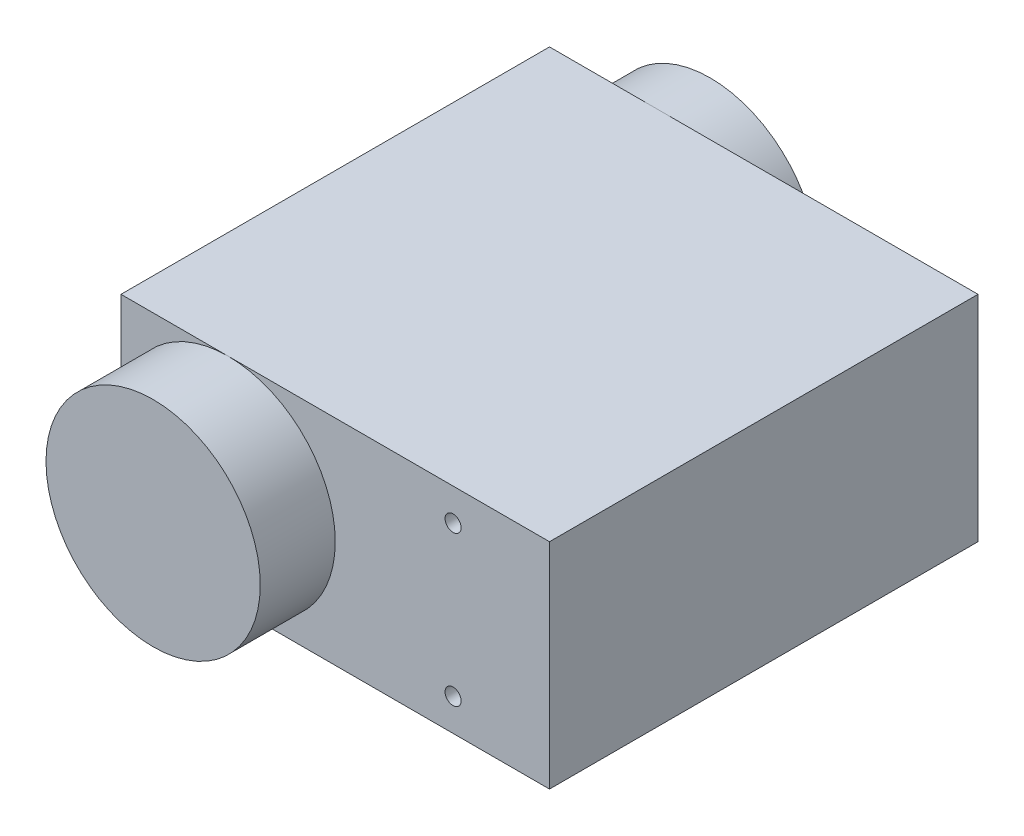
ISO-10303-21;
HEADER;
FILE_DESCRIPTION(('STEP AP214'),'2;1');
FILE_NAME('part.step','',(''),(''),'','','');
FILE_SCHEMA(('AUTOMOTIVE_DESIGN { 1 0 10303 214 1 1 1 1 }'));
ENDSEC;
DATA;
#1=APPLICATION_CONTEXT('core data for automotive mechanical design processes');
#2=APPLICATION_PROTOCOL_DEFINITION('international standard','automotive_design',2000,#1);
#3=PRODUCT_CONTEXT('',#1,'mechanical');
#4=PRODUCT('Part','Part','',(#3));
#5=PRODUCT_RELATED_PRODUCT_CATEGORY('part','',(#4));
#6=PRODUCT_DEFINITION_FORMATION('','',#4);
#7=PRODUCT_DEFINITION_CONTEXT('part definition',#1,'design');
#8=PRODUCT_DEFINITION('design','',#6,#7);
#9=PRODUCT_DEFINITION_SHAPE('','',#8);
#10=(LENGTH_UNIT() NAMED_UNIT(*) SI_UNIT(.MILLI.,.METRE.));
#11=(NAMED_UNIT(*) PLANE_ANGLE_UNIT() SI_UNIT($,.RADIAN.));
#12=(NAMED_UNIT(*) SI_UNIT($,.STERADIAN.) SOLID_ANGLE_UNIT());
#13=UNCERTAINTY_MEASURE_WITH_UNIT(LENGTH_MEASURE(1.E-05),#10,'distance_accuracy_value','');
#14=(GEOMETRIC_REPRESENTATION_CONTEXT(3) GLOBAL_UNCERTAINTY_ASSIGNED_CONTEXT((#13)) GLOBAL_UNIT_ASSIGNED_CONTEXT((#10,
#11,#12)) REPRESENTATION_CONTEXT('',''));
#15=CARTESIAN_POINT('',(0.,0.,0.));
#16=DIRECTION('',(0.,0.,1.));
#17=DIRECTION('',(1.,0.,0.));
#18=AXIS2_PLACEMENT_3D('',#15,#16,#17);
#19=CARTESIAN_POINT('',(0.,20.,40.0000000000001));
#20=DIRECTION('',(0.,0.,-1.));
#21=DIRECTION('',(-1.,0.,0.));
#22=AXIS2_PLACEMENT_3D('',#19,#20,#21);
#23=PLANE('',#22);
#24=DIRECTION('',(0.,-0.999999999999998,0.));
#25=VECTOR('',#24,1.);
#26=CARTESIAN_POINT('',(0.,20.,40.0000000000001));
#27=LINE('',#26,#25);
#28=CARTESIAN_POINT('',(0.,20.,40.0000000000001));
#29=VERTEX_POINT('',#28);
#30=CARTESIAN_POINT('',(0.,9.99999999999995,39.9999999999997));
#31=VERTEX_POINT('',#30);
#32=EDGE_CURVE('E11',#29,#31,#27,.T.);
#33=ORIENTED_EDGE('',*,*,#32,.T.);
#34=CARTESIAN_POINT('',(9.99999999999999,10.,40.0000000000001));
#35=DIRECTION('',(0.,0.,-1.));
#36=DIRECTION('',(-1.,0.,0.));
#37=AXIS2_PLACEMENT_3D('',#34,#35,#36);
#38=CIRCLE('',#37,10.);
#39=CARTESIAN_POINT('',(10.0000000000001,20.,39.9999999999999));
#40=VERTEX_POINT('',#39);
#41=EDGE_CURVE('E49',#31,#40,#38,.T.);
#42=ORIENTED_EDGE('',*,*,#41,.T.);
#43=DIRECTION('',(1.,0.,0.));
#44=VECTOR('',#43,1.);
#45=CARTESIAN_POINT('',(0.,20.,40.0000000000001));
#46=LINE('',#45,#44);
#47=EDGE_CURVE('E158',#29,#40,#46,.T.);
#48=ORIENTED_EDGE('',*,*,#47,.F.);
#49=EDGE_LOOP('',(#33,#42,#48));
#50=FACE_BOUND('',#49,.T.);
#51=ADVANCED_FACE('F34',(#50),#23,.F.);
#52=CARTESIAN_POINT('',(31.0000000000002,3.00000000000023,39.9999999999997));
#53=DIRECTION('',(0.,0.,1.));
#54=DIRECTION('',(1.,0.,0.));
#55=AXIS2_PLACEMENT_3D('',#52,#53,#54);
#56=CIRCLE('',#55,0.749999999999999);
#57=CARTESIAN_POINT('',(31.7500000000002,3.00000000000023,39.9999999999997));
#58=VERTEX_POINT('',#57);
#59=EDGE_CURVE('E173',#58,#58,#56,.T.);
#60=ORIENTED_EDGE('',*,*,#59,.F.);
#61=EDGE_LOOP('',(#60));
#62=FACE_BOUND('',#61,.T.);
#63=CARTESIAN_POINT('',(31.0000000000001,17.0000000000002,39.9999999999999));
#64=DIRECTION('',(0.,0.,1.));
#65=DIRECTION('',(1.,0.,0.));
#66=AXIS2_PLACEMENT_3D('',#63,#64,#65);
#67=CIRCLE('',#66,0.749999999999999);
#68=CARTESIAN_POINT('',(31.7500000000001,17.0000000000002,39.9999999999999));
#69=VERTEX_POINT('',#68);
#70=EDGE_CURVE('E167',#69,#69,#67,.T.);
#71=ORIENTED_EDGE('',*,*,#70,.F.);
#72=EDGE_LOOP('',(#71));
#73=FACE_BOUND('',#72,.T.);
#74=CARTESIAN_POINT('',(40.,20.0000000000001,39.9999999999998));
#75=VERTEX_POINT('',#74);
#76=EDGE_CURVE('E126',#40,#75,#46,.T.);
#77=ORIENTED_EDGE('',*,*,#76,.F.);
#78=CARTESIAN_POINT('',(10.,0.,39.9999999999998));
#79=VERTEX_POINT('',#78);
#80=EDGE_CURVE('E109',#40,#79,#38,.T.);
#81=ORIENTED_EDGE('',*,*,#80,.T.);
#82=DIRECTION('',(1.,0.,0.));
#83=VECTOR('',#82,1.);
#84=CARTESIAN_POINT('',(1.11022302462516E-13,0.,39.9999999999999));
#85=LINE('',#84,#83);
#86=CARTESIAN_POINT('',(40.0000000000002,0.,39.9999999999999));
#87=VERTEX_POINT('',#86);
#88=EDGE_CURVE('E147',#79,#87,#85,.T.);
#89=ORIENTED_EDGE('',*,*,#88,.T.);
#90=DIRECTION('',(0.,-0.999999999999998,0.));
#91=VECTOR('',#90,1.);
#92=CARTESIAN_POINT('',(40.,20.0000000000001,39.9999999999998));
#93=LINE('',#92,#91);
#94=EDGE_CURVE('E133',#75,#87,#93,.T.);
#95=ORIENTED_EDGE('',*,*,#94,.F.);
#96=EDGE_LOOP('',(#77,#81,#89,#95));
#97=FACE_BOUND('',#96,.T.);
#98=ADVANCED_FACE('F188',(#62,#73,#97),#23,.F.);
#99=CARTESIAN_POINT('',(0.,19.9999999999998,0.));
#100=DIRECTION('',(0.,0.,1.));
#101=DIRECTION('',(1.,0.,0.));
#102=AXIS2_PLACEMENT_3D('',#99,#100,#101);
#103=PLANE('',#102);
#104=DIRECTION('',(-1.,0.,0.));
#105=VECTOR('',#104,1.);
#106=CARTESIAN_POINT('',(0.,19.9999999999998,0.));
#107=LINE('',#106,#105);
#108=CARTESIAN_POINT('',(10.0000000000001,20.0000000000001,-1.11022302462516E-13));
#109=VERTEX_POINT('',#108);
#110=CARTESIAN_POINT('',(0.,19.9999999999998,0.));
#111=VERTEX_POINT('',#110);
#112=EDGE_CURVE('E155',#109,#111,#107,.T.);
#113=ORIENTED_EDGE('',*,*,#112,.F.);
#114=CARTESIAN_POINT('',(10.0000000000002,10.0000000000001,-1.11022302462516E-13));
#115=DIRECTION('',(0.,0.,1.));
#116=DIRECTION('',(1.,0.,0.));
#117=AXIS2_PLACEMENT_3D('',#114,#115,#116);
#118=CIRCLE('',#117,10.);
#119=CARTESIAN_POINT('',(0.,10.0000000000001,-1.11022302462516E-13));
#120=VERTEX_POINT('',#119);
#121=EDGE_CURVE('E57',#109,#120,#118,.T.);
#122=ORIENTED_EDGE('',*,*,#121,.T.);
#123=DIRECTION('',(0.,-0.999999999999998,0.));
#124=VECTOR('',#123,1.);
#125=CARTESIAN_POINT('',(0.,19.9999999999998,0.));
#126=LINE('',#125,#124);
#127=EDGE_CURVE('E131',#111,#120,#126,.T.);
#128=ORIENTED_EDGE('',*,*,#127,.F.);
#129=EDGE_LOOP('',(#113,#122,#128));
#130=FACE_BOUND('',#129,.T.);
#131=ADVANCED_FACE('F191',(#130),#103,.F.);
#132=CARTESIAN_POINT('',(0.,0.,0.));
#133=VERTEX_POINT('',#132);
#134=EDGE_CURVE('E107',#120,#133,#126,.T.);
#135=ORIENTED_EDGE('',*,*,#134,.F.);
#136=CARTESIAN_POINT('',(10.0000000000001,2.35922392732846E-13,0.));
#137=VERTEX_POINT('',#136);
#138=EDGE_CURVE('E93',#120,#137,#118,.T.);
#139=ORIENTED_EDGE('',*,*,#138,.T.);
#140=DIRECTION('',(-1.,0.,0.));
#141=VECTOR('',#140,1.);
#142=CARTESIAN_POINT('',(0.,0.,0.));
#143=LINE('',#142,#141);
#144=EDGE_CURVE('E105',#137,#133,#143,.T.);
#145=ORIENTED_EDGE('',*,*,#144,.T.);
#146=EDGE_LOOP('',(#135,#139,#145));
#147=FACE_BOUND('',#146,.T.);
#148=ADVANCED_FACE('F104',(#147),#103,.F.);
#149=CARTESIAN_POINT('',(0.,19.9999999999998,0.));
#150=DIRECTION('',(1.,0.,0.));
#151=DIRECTION('',(0.,0.,-1.));
#152=AXIS2_PLACEMENT_3D('',#149,#150,#151);
#153=PLANE('',#152);
#154=ORIENTED_EDGE('',*,*,#127,.T.);
#155=ORIENTED_EDGE('',*,*,#134,.T.);
#156=DIRECTION('',(0.,0.,1.));
#157=VECTOR('',#156,1.);
#158=CARTESIAN_POINT('',(0.,0.,0.));
#159=LINE('',#158,#157);
#160=CARTESIAN_POINT('',(1.11022302462516E-13,0.,39.9999999999999));
#161=VERTEX_POINT('',#160);
#162=EDGE_CURVE('E117',#133,#161,#159,.T.);
#163=ORIENTED_EDGE('',*,*,#162,.T.);
#164=EDGE_CURVE('E42',#31,#161,#27,.T.);
#165=ORIENTED_EDGE('',*,*,#164,.F.);
#166=ORIENTED_EDGE('',*,*,#32,.F.);
#167=DIRECTION('',(0.,0.,1.));
#168=VECTOR('',#167,1.);
#169=CARTESIAN_POINT('',(0.,19.9999999999998,0.));
#170=LINE('',#169,#168);
#171=EDGE_CURVE('E124',#111,#29,#170,.T.);
#172=ORIENTED_EDGE('',*,*,#171,.F.);
#173=EDGE_LOOP('',(#154,#155,#163,#165,#166,#172));
#174=FACE_BOUND('',#173,.T.);
#175=ADVANCED_FACE('F36',(#174),#153,.F.);
#176=EDGE_CURVE('E142',#161,#79,#85,.T.);
#177=ORIENTED_EDGE('',*,*,#176,.T.);
#178=EDGE_CURVE('E143',#79,#31,#38,.T.);
#179=ORIENTED_EDGE('',*,*,#178,.T.);
#180=ORIENTED_EDGE('',*,*,#164,.T.);
#181=EDGE_LOOP('',(#177,#179,#180));
#182=FACE_BOUND('',#181,.T.);
#183=ADVANCED_FACE('F141',(#182),#23,.F.);
#184=CARTESIAN_POINT('',(40.0000000000001,20.0000000000001,0.));
#185=DIRECTION('',(-1.,0.,0.));
#186=DIRECTION('',(0.,0.,1.));
#187=AXIS2_PLACEMENT_3D('',#184,#185,#186);
#188=PLANE('',#187);
#189=DIRECTION('',(0.,0.,-1.));
#190=VECTOR('',#189,1.);
#191=CARTESIAN_POINT('',(40.0000000000002,0.,-1.11022302462516E-13));
#192=LINE('',#191,#190);
#193=CARTESIAN_POINT('',(40.0000000000002,0.,-1.11022302462516E-13));
#194=VERTEX_POINT('',#193);
#195=EDGE_CURVE('E118',#87,#194,#192,.T.);
#196=ORIENTED_EDGE('',*,*,#195,.T.);
#197=DIRECTION('',(0.,-0.999999999999998,0.));
#198=VECTOR('',#197,1.);
#199=CARTESIAN_POINT('',(40.0000000000001,20.0000000000001,0.));
#200=LINE('',#199,#198);
#201=CARTESIAN_POINT('',(40.0000000000001,20.0000000000001,0.));
#202=VERTEX_POINT('',#201);
#203=EDGE_CURVE('E123',#202,#194,#200,.T.);
#204=ORIENTED_EDGE('',*,*,#203,.F.);
#205=DIRECTION('',(0.,0.,-1.));
#206=VECTOR('',#205,1.);
#207=CARTESIAN_POINT('',(40.0000000000001,20.0000000000001,0.));
#208=LINE('',#207,#206);
#209=EDGE_CURVE('E156',#75,#202,#208,.T.);
#210=ORIENTED_EDGE('',*,*,#209,.F.);
#211=ORIENTED_EDGE('',*,*,#94,.T.);
#212=EDGE_LOOP('',(#196,#204,#210,#211));
#213=FACE_BOUND('',#212,.T.);
#214=ADVANCED_FACE('F201',(#213),#188,.F.);
#215=EDGE_CURVE('E114',#194,#137,#143,.T.);
#216=ORIENTED_EDGE('',*,*,#215,.T.);
#217=EDGE_CURVE('E90',#137,#109,#118,.T.);
#218=ORIENTED_EDGE('',*,*,#217,.T.);
#219=EDGE_CURVE('E152',#202,#109,#107,.T.);
#220=ORIENTED_EDGE('',*,*,#219,.F.);
#221=ORIENTED_EDGE('',*,*,#203,.T.);
#222=EDGE_LOOP('',(#216,#218,#220,#221));
#223=FACE_BOUND('',#222,.T.);
#224=ADVANCED_FACE('F121',(#223),#103,.F.);
#225=CARTESIAN_POINT('',(0.,19.9999999999998,0.));
#226=DIRECTION('',(0.,0.999999999999998,0.));
#227=DIRECTION('',(0.,0.,1.));
#228=AXIS2_PLACEMENT_3D('',#225,#226,#227);
#229=PLANE('',#228);
#230=ORIENTED_EDGE('',*,*,#47,.T.);
#231=ORIENTED_EDGE('',*,*,#76,.T.);
#232=ORIENTED_EDGE('',*,*,#209,.T.);
#233=ORIENTED_EDGE('',*,*,#219,.T.);
#234=ORIENTED_EDGE('',*,*,#112,.T.);
#235=ORIENTED_EDGE('',*,*,#171,.T.);
#236=EDGE_LOOP('',(#230,#231,#232,#233,#234,#235));
#237=FACE_BOUND('',#236,.T.);
#238=ADVANCED_FACE('F196',(#237),#229,.T.);
#239=CARTESIAN_POINT('',(0.,0.,0.));
#240=DIRECTION('',(0.,0.999999999999998,0.));
#241=DIRECTION('',(0.,0.,1.));
#242=AXIS2_PLACEMENT_3D('',#239,#240,#241);
#243=PLANE('',#242);
#244=ORIENTED_EDGE('',*,*,#144,.F.);
#245=ORIENTED_EDGE('',*,*,#215,.F.);
#246=ORIENTED_EDGE('',*,*,#195,.F.);
#247=ORIENTED_EDGE('',*,*,#88,.F.);
#248=ORIENTED_EDGE('',*,*,#176,.F.);
#249=ORIENTED_EDGE('',*,*,#162,.F.);
#250=EDGE_LOOP('',(#244,#245,#246,#247,#248,#249));
#251=FACE_BOUND('',#250,.T.);
#252=ADVANCED_FACE('F112',(#251),#243,.F.);
#253=CARTESIAN_POINT('',(9.99999999999997,9.99999999999995,-5.00000000000028));
#254=DIRECTION('',(0.,0.,1.));
#255=DIRECTION('',(1.,0.,0.));
#256=AXIS2_PLACEMENT_3D('',#253,#254,#255);
#257=PLANE('',#256);
#258=CARTESIAN_POINT('',(9.99999999999997,9.99999999999995,-5.00000000000028));
#259=DIRECTION('',(0.,0.,1.));
#260=DIRECTION('',(1.,0.,0.));
#261=AXIS2_PLACEMENT_3D('',#258,#259,#260);
#262=CIRCLE('',#261,10.);
#263=CARTESIAN_POINT('',(20.,9.99999999999996,-5.00000000000028));
#264=VERTEX_POINT('',#263);
#265=EDGE_CURVE('E98',#264,#264,#262,.T.);
#266=ORIENTED_EDGE('',*,*,#265,.F.);
#267=EDGE_LOOP('',(#266));
#268=FACE_BOUND('',#267,.T.);
#269=ADVANCED_FACE('F262',(#268),#257,.F.);
#270=CARTESIAN_POINT('',(9.99999999999997,9.99999999999995,-5.00000000000028));
#271=DIRECTION('',(0.,0.,1.));
#272=DIRECTION('',(1.,0.,0.));
#273=AXIS2_PLACEMENT_3D('',#270,#271,#272);
#274=CYLINDRICAL_SURFACE('',#273,10.);
#275=ORIENTED_EDGE('',*,*,#265,.T.);
#276=EDGE_LOOP('',(#275));
#277=FACE_BOUND('',#276,.T.);
#278=ORIENTED_EDGE('',*,*,#138,.F.);
#279=ORIENTED_EDGE('',*,*,#121,.F.);
#280=ORIENTED_EDGE('',*,*,#217,.F.);
#281=EDGE_LOOP('',(#278,#279,#280));
#282=FACE_BOUND('',#281,.T.);
#283=ADVANCED_FACE('F92',(#277,#282),#274,.T.);
#284=CARTESIAN_POINT('',(10.0000000000002,10.0000000000001,46.9999999999998));
#285=DIRECTION('',(0.,0.,1.));
#286=DIRECTION('',(1.,0.,0.));
#287=AXIS2_PLACEMENT_3D('',#284,#285,#286);
#288=CIRCLE('',#287,10.);
#289=CARTESIAN_POINT('',(20.0000000000002,10.0000000000001,46.9999999999998));
#290=VERTEX_POINT('',#289);
#291=EDGE_CURVE('E163',#290,#290,#288,.T.);
#292=ORIENTED_EDGE('',*,*,#291,.F.);
#293=EDGE_LOOP('',(#292));
#294=FACE_BOUND('',#293,.T.);
#295=ORIENTED_EDGE('',*,*,#80,.F.);
#296=ORIENTED_EDGE('',*,*,#41,.F.);
#297=ORIENTED_EDGE('',*,*,#178,.F.);
#298=EDGE_LOOP('',(#295,#296,#297));
#299=FACE_BOUND('',#298,.T.);
#300=ADVANCED_FACE('F280',(#294,#299),#274,.T.);
#301=CARTESIAN_POINT('',(10.0000000000002,10.0000000000001,46.9999999999998));
#302=DIRECTION('',(0.,0.,1.));
#303=DIRECTION('',(1.,0.,0.));
#304=AXIS2_PLACEMENT_3D('',#301,#302,#303);
#305=PLANE('',#304);
#306=ORIENTED_EDGE('',*,*,#291,.T.);
#307=EDGE_LOOP('',(#306));
#308=FACE_BOUND('',#307,.T.);
#309=ADVANCED_FACE('F290',(#308),#305,.T.);
#310=CARTESIAN_POINT('',(31.,17.0000000000001,36.9999999999999));
#311=DIRECTION('',(0.,0.,1.));
#312=DIRECTION('',(1.,0.,0.));
#313=AXIS2_PLACEMENT_3D('',#310,#311,#312);
#314=CYLINDRICAL_SURFACE('',#313,0.749999999999999);
#315=CARTESIAN_POINT('',(31.,17.0000000000001,36.9999999999999));
#316=DIRECTION('',(0.,0.,1.));
#317=DIRECTION('',(1.,0.,0.));
#318=AXIS2_PLACEMENT_3D('',#315,#316,#317);
#319=CIRCLE('',#318,0.749999999999999);
#320=CARTESIAN_POINT('',(31.75,17.0000000000001,36.9999999999999));
#321=VERTEX_POINT('',#320);
#322=EDGE_CURVE('E166',#321,#321,#319,.T.);
#323=ORIENTED_EDGE('',*,*,#322,.F.);
#324=EDGE_LOOP('',(#323));
#325=FACE_BOUND('',#324,.T.);
#326=ORIENTED_EDGE('',*,*,#70,.T.);
#327=EDGE_LOOP('',(#326));
#328=FACE_BOUND('',#327,.T.);
#329=ADVANCED_FACE('F299',(#325,#328),#314,.F.);
#330=CARTESIAN_POINT('',(31.,17.0000000000001,36.9999999999999));
#331=DIRECTION('',(0.,0.,1.));
#332=DIRECTION('',(1.,0.,0.));
#333=AXIS2_PLACEMENT_3D('',#330,#331,#332);
#334=PLANE('',#333);
#335=ORIENTED_EDGE('',*,*,#322,.T.);
#336=EDGE_LOOP('',(#335));
#337=FACE_BOUND('',#336,.T.);
#338=ADVANCED_FACE('F184',(#337),#334,.T.);
#339=CARTESIAN_POINT('',(31.,3.,36.9999999999998));
#340=DIRECTION('',(0.,0.,1.));
#341=DIRECTION('',(1.,0.,0.));
#342=AXIS2_PLACEMENT_3D('',#339,#340,#341);
#343=CYLINDRICAL_SURFACE('',#342,0.749999999999999);
#344=CARTESIAN_POINT('',(31.,3.,36.9999999999998));
#345=DIRECTION('',(0.,0.,1.));
#346=DIRECTION('',(1.,0.,0.));
#347=AXIS2_PLACEMENT_3D('',#344,#345,#346);
#348=CIRCLE('',#347,0.749999999999999);
#349=CARTESIAN_POINT('',(31.75,3.,36.9999999999998));
#350=VERTEX_POINT('',#349);
#351=EDGE_CURVE('E170',#350,#350,#348,.T.);
#352=ORIENTED_EDGE('',*,*,#351,.F.);
#353=EDGE_LOOP('',(#352));
#354=FACE_BOUND('',#353,.T.);
#355=ORIENTED_EDGE('',*,*,#59,.T.);
#356=EDGE_LOOP('',(#355));
#357=FACE_BOUND('',#356,.T.);
#358=ADVANCED_FACE('F181',(#354,#357),#343,.F.);
#359=CARTESIAN_POINT('',(31.,3.,36.9999999999998));
#360=DIRECTION('',(0.,0.,1.));
#361=DIRECTION('',(1.,0.,0.));
#362=AXIS2_PLACEMENT_3D('',#359,#360,#361);
#363=PLANE('',#362);
#364=ORIENTED_EDGE('',*,*,#351,.T.);
#365=EDGE_LOOP('',(#364));
#366=FACE_BOUND('',#365,.T.);
#367=ADVANCED_FACE('F179',(#366),#363,.T.);
#368=CLOSED_SHELL('',(#51,#98,#131,#148,#175,#183,#214,#224,#238,#252,#269,#283,#300,#309,#329,
#338,#358,#367));
#369=MANIFOLD_SOLID_BREP('B2',#368);
#370=ADVANCED_BREP_SHAPE_REPRESENTATION('',(#18,#369),#14);
#371=SHAPE_DEFINITION_REPRESENTATION(#9,#370);
ENDSEC;
END-ISO-10303-21;
